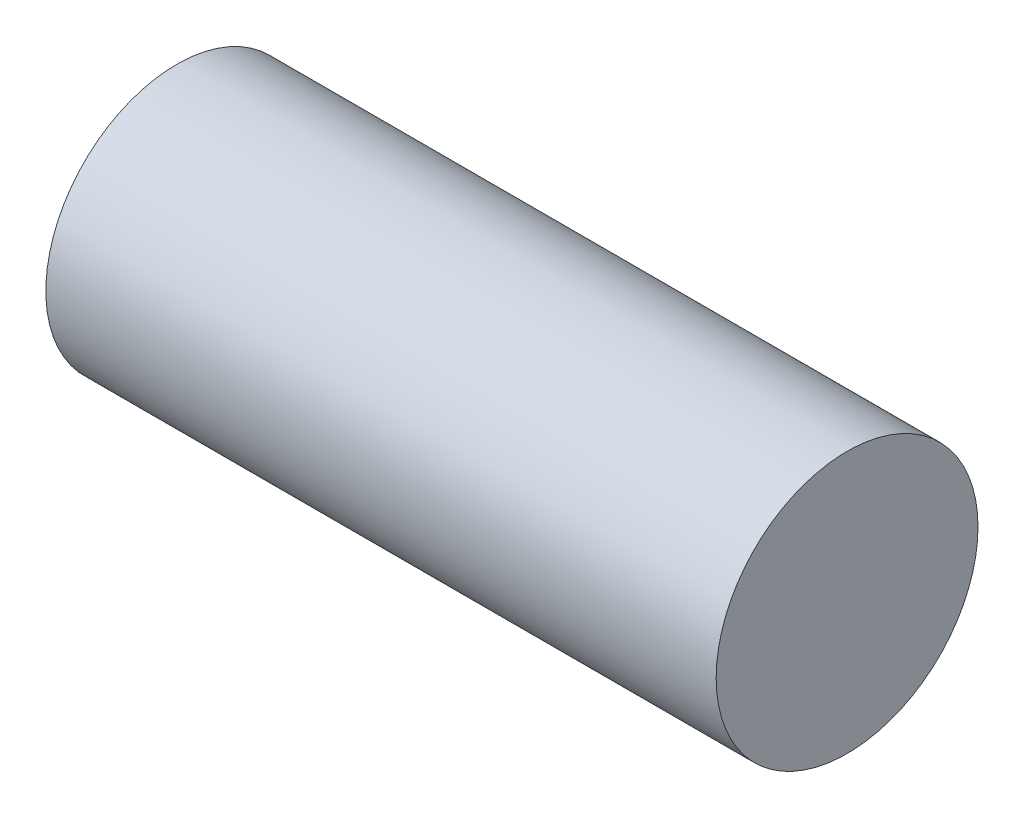
ISO-10303-21;
HEADER;
FILE_DESCRIPTION(('STEP AP214'),'2;1');
FILE_NAME('part.step','',(''),(''),'','','');
FILE_SCHEMA(('AUTOMOTIVE_DESIGN { 1 0 10303 214 1 1 1 1 }'));
ENDSEC;
DATA;
#1=APPLICATION_CONTEXT('core data for automotive mechanical design processes');
#2=APPLICATION_PROTOCOL_DEFINITION('international standard','automotive_design',2000,#1);
#3=PRODUCT_CONTEXT('',#1,'mechanical');
#4=PRODUCT('Part','Part','',(#3));
#5=PRODUCT_RELATED_PRODUCT_CATEGORY('part','',(#4));
#6=PRODUCT_DEFINITION_FORMATION('','',#4);
#7=PRODUCT_DEFINITION_CONTEXT('part definition',#1,'design');
#8=PRODUCT_DEFINITION('design','',#6,#7);
#9=PRODUCT_DEFINITION_SHAPE('','',#8);
#10=(LENGTH_UNIT() NAMED_UNIT(*) SI_UNIT(.MILLI.,.METRE.));
#11=(NAMED_UNIT(*) PLANE_ANGLE_UNIT() SI_UNIT($,.RADIAN.));
#12=(NAMED_UNIT(*) SI_UNIT($,.STERADIAN.) SOLID_ANGLE_UNIT());
#13=UNCERTAINTY_MEASURE_WITH_UNIT(LENGTH_MEASURE(1.E-05),#10,'distance_accuracy_value','');
#14=(GEOMETRIC_REPRESENTATION_CONTEXT(3) GLOBAL_UNCERTAINTY_ASSIGNED_CONTEXT((#13)) GLOBAL_UNIT_ASSIGNED_CONTEXT((#10,
#11,#12)) REPRESENTATION_CONTEXT('',''));
#15=CARTESIAN_POINT('',(0.,0.,0.));
#16=DIRECTION('',(0.,0.,1.));
#17=DIRECTION('',(1.,0.,0.));
#18=AXIS2_PLACEMENT_3D('',#15,#16,#17);
#19=CARTESIAN_POINT('',(6.4,0.,0.));
#20=DIRECTION('',(1.,0.,0.));
#21=DIRECTION('',(0.,0.,-1.));
#22=AXIS2_PLACEMENT_3D('',#19,#20,#21);
#23=PLANE('',#22);
#24=CARTESIAN_POINT('',(6.4,0.,0.));
#25=DIRECTION('',(-1.,0.,0.));
#26=DIRECTION('',(0.,0.,1.));
#27=AXIS2_PLACEMENT_3D('',#24,#25,#26);
#28=CIRCLE('',#27,2.5);
#29=CARTESIAN_POINT('',(6.4,0.,2.5));
#30=VERTEX_POINT('',#29);
#31=EDGE_CURVE('E9',#30,#30,#28,.T.);
#32=ORIENTED_EDGE('',*,*,#31,.F.);
#33=EDGE_LOOP('',(#32));
#34=FACE_BOUND('',#33,.T.);
#35=ADVANCED_FACE('F14',(#34),#23,.T.);
#36=CARTESIAN_POINT('',(-6.4,0.,0.));
#37=DIRECTION('',(-1.,0.,0.));
#38=DIRECTION('',(0.,0.,1.));
#39=AXIS2_PLACEMENT_3D('',#36,#37,#38);
#40=PLANE('',#39);
#41=CARTESIAN_POINT('',(-6.4,0.,0.));
#42=DIRECTION('',(1.,0.,0.));
#43=DIRECTION('',(0.,0.,-1.));
#44=AXIS2_PLACEMENT_3D('',#41,#42,#43);
#45=CIRCLE('',#44,2.5);
#46=CARTESIAN_POINT('',(-6.4,0.,-2.5));
#47=VERTEX_POINT('',#46);
#48=EDGE_CURVE('E21',#47,#47,#45,.T.);
#49=ORIENTED_EDGE('',*,*,#48,.F.);
#50=EDGE_LOOP('',(#49));
#51=FACE_BOUND('',#50,.T.);
#52=ADVANCED_FACE('F28',(#51),#40,.T.);
#53=CARTESIAN_POINT('',(-6.4,0.,0.));
#54=DIRECTION('',(1.,0.,0.));
#55=DIRECTION('',(0.,0.,-1.));
#56=AXIS2_PLACEMENT_3D('',#53,#54,#55);
#57=CYLINDRICAL_SURFACE('',#56,2.5);
#58=ORIENTED_EDGE('',*,*,#31,.T.);
#59=EDGE_LOOP('',(#58));
#60=FACE_BOUND('',#59,.T.);
#61=ORIENTED_EDGE('',*,*,#48,.T.);
#62=EDGE_LOOP('',(#61));
#63=FACE_BOUND('',#62,.T.);
#64=ADVANCED_FACE('F16',(#60,#63),#57,.T.);
#65=CLOSED_SHELL('',(#35,#52,#64));
#66=MANIFOLD_SOLID_BREP('B1',#65);
#67=ADVANCED_BREP_SHAPE_REPRESENTATION('',(#18,#66),#14);
#68=SHAPE_DEFINITION_REPRESENTATION(#9,#67);
ENDSEC;
END-ISO-10303-21;
